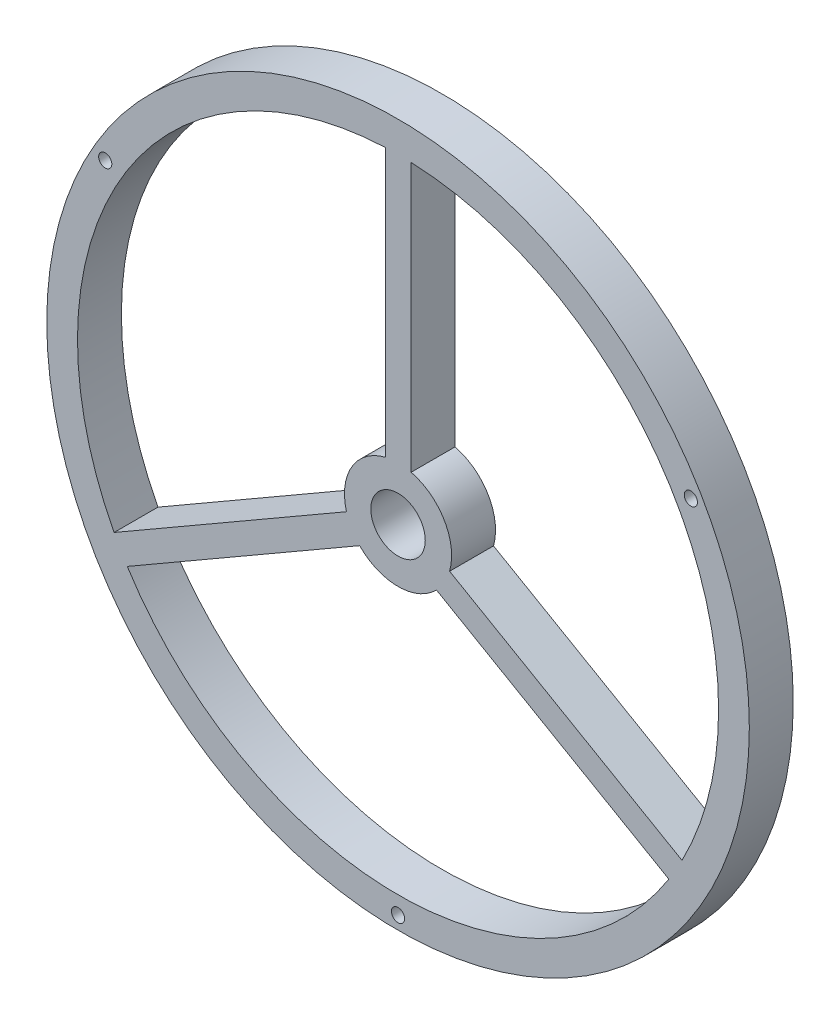
ISO-10303-21;
HEADER;
FILE_DESCRIPTION(('STEP AP214'),'2;1');
FILE_NAME('part.step','',(''),(''),'','','');
FILE_SCHEMA(('AUTOMOTIVE_DESIGN { 1 0 10303 214 1 1 1 1 }'));
ENDSEC;
DATA;
#1=APPLICATION_CONTEXT('core data for automotive mechanical design processes');
#2=APPLICATION_PROTOCOL_DEFINITION('international standard','automotive_design',2000,#1);
#3=PRODUCT_CONTEXT('',#1,'mechanical');
#4=PRODUCT('Part','Part','',(#3));
#5=PRODUCT_RELATED_PRODUCT_CATEGORY('part','',(#4));
#6=PRODUCT_DEFINITION_FORMATION('','',#4);
#7=PRODUCT_DEFINITION_CONTEXT('part definition',#1,'design');
#8=PRODUCT_DEFINITION('design','',#6,#7);
#9=PRODUCT_DEFINITION_SHAPE('','',#8);
#10=(LENGTH_UNIT() NAMED_UNIT(*) SI_UNIT(.MILLI.,.METRE.));
#11=(NAMED_UNIT(*) PLANE_ANGLE_UNIT() SI_UNIT($,.RADIAN.));
#12=(NAMED_UNIT(*) SI_UNIT($,.STERADIAN.) SOLID_ANGLE_UNIT());
#13=UNCERTAINTY_MEASURE_WITH_UNIT(LENGTH_MEASURE(1.E-05),#10,'distance_accuracy_value','');
#14=(GEOMETRIC_REPRESENTATION_CONTEXT(3) GLOBAL_UNCERTAINTY_ASSIGNED_CONTEXT((#13)) GLOBAL_UNIT_ASSIGNED_CONTEXT((#10,
#11,#12)) REPRESENTATION_CONTEXT('',''));
#15=CARTESIAN_POINT('',(0.,0.,0.));
#16=DIRECTION('',(0.,0.,1.));
#17=DIRECTION('',(1.,0.,0.));
#18=AXIS2_PLACEMENT_3D('',#15,#16,#17);
#19=CARTESIAN_POINT('',(46.8483422096142,0.,5.));
#20=DIRECTION('',(1.,0.,0.));
#21=DIRECTION('',(0.,1.,0.));
#22=AXIS2_PLACEMENT_3D('',#19,#20,#21);
#23=PLANE('',#22);
#24=DIRECTION('',(0.,-1.,0.));
#25=VECTOR('',#24,1.);
#26=CARTESIAN_POINT('',(46.8483422096142,0.,0.));
#27=LINE('',#26,#25);
#28=CARTESIAN_POINT('',(46.8483422096142,64.3961689263442,0.));
#29=VERTEX_POINT('',#28);
#30=CARTESIAN_POINT('',(46.8483422096142,33.8505224689132,0.));
#31=VERTEX_POINT('',#30);
#32=EDGE_CURVE('E188',#29,#31,#27,.T.);
#33=ORIENTED_EDGE('',*,*,#32,.T.);
#34=DIRECTION('',(0.,0.,-1.));
#35=VECTOR('',#34,1.);
#36=CARTESIAN_POINT('',(46.8483422096142,33.8505224689132,5.));
#37=LINE('',#36,#35);
#38=CARTESIAN_POINT('',(46.8483422096142,33.8505224689132,5.));
#39=VERTEX_POINT('',#38);
#40=EDGE_CURVE('E11',#39,#31,#37,.T.);
#41=ORIENTED_EDGE('',*,*,#40,.F.);
#42=DIRECTION('',(0.,-1.,0.));
#43=VECTOR('',#42,1.);
#44=CARTESIAN_POINT('',(46.8483422096142,0.,5.));
#45=LINE('',#44,#43);
#46=CARTESIAN_POINT('',(46.8483422096142,64.3961689263442,5.));
#47=VERTEX_POINT('',#46);
#48=EDGE_CURVE('E140',#47,#39,#45,.T.);
#49=ORIENTED_EDGE('',*,*,#48,.F.);
#50=DIRECTION('',(0.,0.,-1.));
#51=VECTOR('',#50,1.);
#52=CARTESIAN_POINT('',(46.8483422096142,64.3961689263442,5.));
#53=LINE('',#52,#51);
#54=EDGE_CURVE('E54',#47,#29,#53,.T.);
#55=ORIENTED_EDGE('',*,*,#54,.T.);
#56=EDGE_LOOP('',(#33,#41,#49,#55));
#57=FACE_BOUND('',#56,.T.);
#58=ADVANCED_FACE('F35',(#57),#23,.F.);
#59=CARTESIAN_POINT('',(48.2964743549606,27.9249074552953,5.));
#60=DIRECTION('',(0.,0.,-1.));
#61=DIRECTION('',(-1.,0.,0.));
#62=AXIS2_PLACEMENT_3D('',#59,#60,#61);
#63=CYLINDRICAL_SURFACE('',#62,6.1);
#64=CARTESIAN_POINT('',(48.2964743549606,27.9249074552953,0.));
#65=DIRECTION('',(0.,0.,1.));
#66=DIRECTION('',(1.,0.,0.));
#67=AXIS2_PLACEMENT_3D('',#64,#65,#66);
#68=CIRCLE('',#67,6.1);
#69=CARTESIAN_POINT('',(42.4259275091637,26.267596461153,0.));
#70=VERTEX_POINT('',#69);
#71=EDGE_CURVE('E147',#31,#70,#68,.T.);
#72=ORIENTED_EDGE('',*,*,#71,.T.);
#73=DIRECTION('',(0.,0.,-1.));
#74=VECTOR('',#73,1.);
#75=CARTESIAN_POINT('',(42.4259275091637,26.267596461153,5.));
#76=LINE('',#75,#74);
#77=CARTESIAN_POINT('',(42.4259275091637,26.267596461153,5.));
#78=VERTEX_POINT('',#77);
#79=EDGE_CURVE('E45',#78,#70,#76,.T.);
#80=ORIENTED_EDGE('',*,*,#79,.F.);
#81=CARTESIAN_POINT('',(48.2964743549606,27.9249074552953,5.));
#82=DIRECTION('',(0.,0.,1.));
#83=DIRECTION('',(1.,0.,0.));
#84=AXIS2_PLACEMENT_3D('',#81,#82,#83);
#85=CIRCLE('',#84,6.1);
#86=EDGE_CURVE('E133',#39,#78,#85,.T.);
#87=ORIENTED_EDGE('',*,*,#86,.F.);
#88=ORIENTED_EDGE('',*,*,#40,.T.);
#89=EDGE_LOOP('',(#72,#80,#87,#88));
#90=FACE_BOUND('',#89,.T.);
#91=ADVANCED_FACE('F146',(#90),#63,.T.);
#92=CARTESIAN_POINT('',(-0.767721038567435,1.32973184483834,5.));
#93=DIRECTION('',(-0.5,0.866025403784438,0.));
#94=DIRECTION('',(-0.866025403784438,-0.5,0.));
#95=AXIS2_PLACEMENT_3D('',#92,#93,#94);
#96=PLANE('',#95);
#97=DIRECTION('',(0.866025403784439,0.5,0.));
#98=VECTOR('',#97,1.);
#99=CARTESIAN_POINT('',(-0.767721038567435,1.32973184483834,0.));
#100=LINE('',#99,#98);
#101=CARTESIAN_POINT('',(15.963250960253,10.9893630321614,0.));
#102=VERTEX_POINT('',#101);
#103=EDGE_CURVE('E190',#102,#70,#100,.T.);
#104=ORIENTED_EDGE('',*,*,#103,.F.);
#105=DIRECTION('',(0.,0.,-1.));
#106=VECTOR('',#105,1.);
#107=CARTESIAN_POINT('',(15.963250960253,10.9893630321614,5.));
#108=LINE('',#107,#106);
#109=CARTESIAN_POINT('',(15.963250960253,10.9893630321614,5.));
#110=VERTEX_POINT('',#109);
#111=EDGE_CURVE('E92',#110,#102,#108,.T.);
#112=ORIENTED_EDGE('',*,*,#111,.F.);
#113=DIRECTION('',(0.866025403784439,0.5,0.));
#114=VECTOR('',#113,1.);
#115=CARTESIAN_POINT('',(-0.767721038567435,1.32973184483834,5.));
#116=LINE('',#115,#114);
#117=EDGE_CURVE('E139',#110,#78,#116,.T.);
#118=ORIENTED_EDGE('',*,*,#117,.T.);
#119=ORIENTED_EDGE('',*,*,#79,.T.);
#120=EDGE_LOOP('',(#104,#112,#118,#119));
#121=FACE_BOUND('',#120,.T.);
#122=ADVANCED_FACE('F151',(#121),#96,.T.);
#123=CARTESIAN_POINT('',(43.9259275091637,23.6695202497997,0.));
#124=VERTEX_POINT('',#123);
#125=CARTESIAN_POINT('',(52.6670212007574,23.6695202497997,0.));
#126=VERTEX_POINT('',#125);
#127=EDGE_CURVE('E172',#124,#126,#68,.T.);
#128=ORIENTED_EDGE('',*,*,#127,.T.);
#129=DIRECTION('',(0.,0.,-1.));
#130=VECTOR('',#129,1.);
#131=CARTESIAN_POINT('',(52.6670212007574,23.6695202497997,5.));
#132=LINE('',#131,#130);
#133=CARTESIAN_POINT('',(52.6670212007574,23.6695202497997,5.));
#134=VERTEX_POINT('',#133);
#135=EDGE_CURVE('E199',#134,#126,#132,.T.);
#136=ORIENTED_EDGE('',*,*,#135,.F.);
#137=CARTESIAN_POINT('',(43.9259275091637,23.6695202497997,5.));
#138=VERTEX_POINT('',#137);
#139=EDGE_CURVE('E144',#138,#134,#85,.T.);
#140=ORIENTED_EDGE('',*,*,#139,.F.);
#141=DIRECTION('',(0.,0.,-1.));
#142=VECTOR('',#141,1.);
#143=CARTESIAN_POINT('',(43.9259275091637,23.6695202497997,5.));
#144=LINE('',#143,#142);
#145=EDGE_CURVE('E201',#138,#124,#144,.T.);
#146=ORIENTED_EDGE('',*,*,#145,.T.);
#147=EDGE_LOOP('',(#128,#136,#140,#146));
#148=FACE_BOUND('',#147,.T.);
#149=ADVANCED_FACE('F303',(#148),#63,.T.);
#150=CARTESIAN_POINT('',(23.4159582160477,40.5576293381045,5.));
#151=DIRECTION('',(0.5,0.866025403784439,0.));
#152=DIRECTION('',(-0.866025403784439,0.5,0.));
#153=AXIS2_PLACEMENT_3D('',#150,#151,#152);
#154=PLANE('',#153);
#155=DIRECTION('',(0.866025403784439,-0.5,0.));
#156=VECTOR('',#155,1.);
#157=CARTESIAN_POINT('',(23.4159582160477,40.5576293381045,0.));
#158=LINE('',#157,#156);
#159=CARTESIAN_POINT('',(79.1296977496681,8.39128682080813,0.));
#160=VERTEX_POINT('',#159);
#161=EDGE_CURVE('E182',#126,#160,#158,.T.);
#162=ORIENTED_EDGE('',*,*,#161,.T.);
#163=DIRECTION('',(0.,0.,-1.));
#164=VECTOR('',#163,1.);
#165=CARTESIAN_POINT('',(79.1296977496681,8.39128682080813,5.));
#166=LINE('',#165,#164);
#167=CARTESIAN_POINT('',(79.1296977496681,8.39128682080813,5.));
#168=VERTEX_POINT('',#167);
#169=EDGE_CURVE('E205',#168,#160,#166,.T.);
#170=ORIENTED_EDGE('',*,*,#169,.F.);
#171=DIRECTION('',(0.866025403784439,-0.5,0.));
#172=VECTOR('',#171,1.);
#173=CARTESIAN_POINT('',(23.4159582160477,40.5576293381045,5.));
#174=LINE('',#173,#172);
#175=EDGE_CURVE('E239',#134,#168,#174,.T.);
#176=ORIENTED_EDGE('',*,*,#175,.F.);
#177=ORIENTED_EDGE('',*,*,#135,.T.);
#178=EDGE_LOOP('',(#162,#170,#176,#177));
#179=FACE_BOUND('',#178,.T.);
#180=ADVANCED_FACE('F311',(#179),#154,.F.);
#181=CARTESIAN_POINT('',(48.2964743549606,27.9249074552953,5.));
#182=DIRECTION('',(0.,0.,-1.));
#183=DIRECTION('',(-1.,0.,0.));
#184=AXIS2_PLACEMENT_3D('',#181,#182,#183);
#185=CYLINDRICAL_SURFACE('',#184,36.5);
#186=CARTESIAN_POINT('',(48.2964743549606,27.9249074552953,0.));
#187=DIRECTION('',(0.,0.,1.));
#188=DIRECTION('',(1.,0.,0.));
#189=AXIS2_PLACEMENT_3D('',#186,#187,#188);
#190=CIRCLE('',#189,36.5);
#191=CARTESIAN_POINT('',(17.463250960253,8.39128682080814,0.));
#192=VERTEX_POINT('',#191);
#193=EDGE_CURVE('E180',#192,#160,#190,.T.);
#194=ORIENTED_EDGE('',*,*,#193,.F.);
#195=DIRECTION('',(0.,0.,-1.));
#196=VECTOR('',#195,1.);
#197=CARTESIAN_POINT('',(17.463250960253,8.39128682080814,5.));
#198=LINE('',#197,#196);
#199=CARTESIAN_POINT('',(17.463250960253,8.39128682080814,5.));
#200=VERTEX_POINT('',#199);
#201=EDGE_CURVE('E203',#200,#192,#198,.T.);
#202=ORIENTED_EDGE('',*,*,#201,.F.);
#203=CARTESIAN_POINT('',(48.2964743549606,27.9249074552953,5.));
#204=DIRECTION('',(0.,0.,1.));
#205=DIRECTION('',(1.,0.,0.));
#206=AXIS2_PLACEMENT_3D('',#203,#204,#205);
#207=CIRCLE('',#206,36.5);
#208=EDGE_CURVE('E156',#200,#168,#207,.T.);
#209=ORIENTED_EDGE('',*,*,#208,.T.);
#210=ORIENTED_EDGE('',*,*,#169,.T.);
#211=EDGE_LOOP('',(#194,#202,#209,#210));
#212=FACE_BOUND('',#211,.T.);
#213=ADVANCED_FACE('F313',(#212),#185,.F.);
#214=CARTESIAN_POINT('',(54.1670212007574,26.267596461153,0.));
#215=VERTEX_POINT('',#214);
#216=CARTESIAN_POINT('',(49.7879309777147,33.8397664681918,0.));
#217=VERTEX_POINT('',#216);
#218=EDGE_CURVE('E167',#215,#217,#68,.T.);
#219=ORIENTED_EDGE('',*,*,#218,.T.);
#220=DIRECTION('',(0.,0.,-1.));
#221=VECTOR('',#220,1.);
#222=CARTESIAN_POINT('',(49.7879309777147,33.8397664681918,5.));
#223=LINE('',#222,#221);
#224=CARTESIAN_POINT('',(49.7879309777147,33.8397664681918,5.));
#225=VERTEX_POINT('',#224);
#226=EDGE_CURVE('E39',#225,#217,#223,.T.);
#227=ORIENTED_EDGE('',*,*,#226,.F.);
#228=CARTESIAN_POINT('',(54.1670212007574,26.267596461153,5.));
#229=VERTEX_POINT('',#228);
#230=EDGE_CURVE('E105',#229,#225,#85,.T.);
#231=ORIENTED_EDGE('',*,*,#230,.F.);
#232=DIRECTION('',(0.,0.,-1.));
#233=VECTOR('',#232,1.);
#234=CARTESIAN_POINT('',(54.1670212007574,26.267596461153,5.));
#235=LINE('',#234,#233);
#236=EDGE_CURVE('E166',#229,#215,#235,.T.);
#237=ORIENTED_EDGE('',*,*,#236,.T.);
#238=EDGE_LOOP('',(#219,#227,#231,#237));
#239=FACE_BOUND('',#238,.T.);
#240=ADVANCED_FACE('F222',(#239),#63,.T.);
#241=CARTESIAN_POINT('',(49.7879309777147,0.,5.));
#242=DIRECTION('',(1.,0.,0.));
#243=DIRECTION('',(0.,1.,0.));
#244=AXIS2_PLACEMENT_3D('',#241,#242,#243);
#245=PLANE('',#244);
#246=DIRECTION('',(0.,-1.,0.));
#247=VECTOR('',#246,1.);
#248=CARTESIAN_POINT('',(49.7879309777147,0.,0.));
#249=LINE('',#248,#247);
#250=CARTESIAN_POINT('',(49.7879309777147,64.3944229050849,0.));
#251=VERTEX_POINT('',#250);
#252=EDGE_CURVE('E170',#251,#217,#249,.T.);
#253=ORIENTED_EDGE('',*,*,#252,.F.);
#254=DIRECTION('',(0.,0.,-1.));
#255=VECTOR('',#254,1.);
#256=CARTESIAN_POINT('',(49.7879309777147,64.3944229050849,5.));
#257=LINE('',#256,#255);
#258=CARTESIAN_POINT('',(49.7879309777147,64.3944229050849,5.));
#259=VERTEX_POINT('',#258);
#260=EDGE_CURVE('E212',#259,#251,#257,.T.);
#261=ORIENTED_EDGE('',*,*,#260,.F.);
#262=DIRECTION('',(0.,-1.,0.));
#263=VECTOR('',#262,1.);
#264=CARTESIAN_POINT('',(49.7879309777147,0.,5.));
#265=LINE('',#264,#263);
#266=EDGE_CURVE('E219',#259,#225,#265,.T.);
#267=ORIENTED_EDGE('',*,*,#266,.T.);
#268=ORIENTED_EDGE('',*,*,#226,.T.);
#269=EDGE_LOOP('',(#253,#261,#267,#268));
#270=FACE_BOUND('',#269,.T.);
#271=ADVANCED_FACE('F37',(#270),#245,.T.);
#272=CARTESIAN_POINT('',(80.6296977496681,10.9893630321614,0.));
#273=VERTEX_POINT('',#272);
#274=EDGE_CURVE('E175',#273,#251,#190,.T.);
#275=ORIENTED_EDGE('',*,*,#274,.F.);
#276=DIRECTION('',(0.,0.,-1.));
#277=VECTOR('',#276,1.);
#278=CARTESIAN_POINT('',(80.6296977496681,10.9893630321614,5.));
#279=LINE('',#278,#277);
#280=CARTESIAN_POINT('',(80.6296977496681,10.9893630321614,5.));
#281=VERTEX_POINT('',#280);
#282=EDGE_CURVE('E211',#281,#273,#279,.T.);
#283=ORIENTED_EDGE('',*,*,#282,.F.);
#284=EDGE_CURVE('E157',#281,#259,#207,.T.);
#285=ORIENTED_EDGE('',*,*,#284,.T.);
#286=ORIENTED_EDGE('',*,*,#260,.T.);
#287=EDGE_LOOP('',(#275,#283,#285,#286));
#288=FACE_BOUND('',#287,.T.);
#289=ADVANCED_FACE('F228',(#288),#185,.F.);
#290=CARTESIAN_POINT('',(48.2964743549606,27.9249074552953,5.));
#291=DIRECTION('',(0.,0.,-1.));
#292=DIRECTION('',(-1.,0.,0.));
#293=AXIS2_PLACEMENT_3D('',#290,#291,#292);
#294=CYLINDRICAL_SURFACE('',#293,40.);
#295=CARTESIAN_POINT('',(48.2964743549606,27.9249074552953,5.));
#296=DIRECTION('',(0.,0.,1.));
#297=DIRECTION('',(1.,0.,0.));
#298=AXIS2_PLACEMENT_3D('',#295,#296,#297);
#299=CIRCLE('',#298,40.);
#300=CARTESIAN_POINT('',(88.2964743549606,27.9249074552953,5.));
#301=VERTEX_POINT('',#300);
#302=EDGE_CURVE('E154',#301,#301,#299,.T.);
#303=ORIENTED_EDGE('',*,*,#302,.F.);
#304=EDGE_LOOP('',(#303));
#305=FACE_BOUND('',#304,.T.);
#306=CARTESIAN_POINT('',(48.2964743549606,27.9249074552953,0.));
#307=DIRECTION('',(0.,0.,1.));
#308=DIRECTION('',(1.,0.,0.));
#309=AXIS2_PLACEMENT_3D('',#306,#307,#308);
#310=CIRCLE('',#309,40.);
#311=CARTESIAN_POINT('',(88.2964743549606,27.9249074552953,0.));
#312=VERTEX_POINT('',#311);
#313=EDGE_CURVE('E192',#312,#312,#310,.T.);
#314=ORIENTED_EDGE('',*,*,#313,.T.);
#315=EDGE_LOOP('',(#314));
#316=FACE_BOUND('',#315,.T.);
#317=ADVANCED_FACE('F325',(#305,#316),#294,.T.);
#318=EDGE_CURVE('E179',#29,#102,#190,.T.);
#319=ORIENTED_EDGE('',*,*,#318,.F.);
#320=ORIENTED_EDGE('',*,*,#54,.F.);
#321=EDGE_CURVE('E152',#47,#110,#207,.T.);
#322=ORIENTED_EDGE('',*,*,#321,.T.);
#323=ORIENTED_EDGE('',*,*,#111,.T.);
#324=EDGE_LOOP('',(#319,#320,#322,#323));
#325=FACE_BOUND('',#324,.T.);
#326=ADVANCED_FACE('F309',(#325),#185,.F.);
#327=CARTESIAN_POINT('',(0.732278961432563,-1.26834436651497,5.));
#328=DIRECTION('',(0.5,-0.866025403784439,0.));
#329=DIRECTION('',(0.866025403784439,0.5,0.));
#330=AXIS2_PLACEMENT_3D('',#327,#328,#329);
#331=PLANE('',#330);
#332=DIRECTION('',(-0.866025403784439,-0.5,0.));
#333=VECTOR('',#332,1.);
#334=CARTESIAN_POINT('',(0.732278961432563,-1.26834436651497,0.));
#335=LINE('',#334,#333);
#336=EDGE_CURVE('E185',#124,#192,#335,.T.);
#337=ORIENTED_EDGE('',*,*,#336,.F.);
#338=ORIENTED_EDGE('',*,*,#145,.F.);
#339=DIRECTION('',(-0.866025403784439,-0.5,0.));
#340=VECTOR('',#339,1.);
#341=CARTESIAN_POINT('',(0.732278961432563,-1.26834436651497,5.));
#342=LINE('',#341,#340);
#343=EDGE_CURVE('E238',#138,#200,#342,.T.);
#344=ORIENTED_EDGE('',*,*,#343,.T.);
#345=ORIENTED_EDGE('',*,*,#201,.T.);
#346=EDGE_LOOP('',(#337,#338,#344,#345));
#347=FACE_BOUND('',#346,.T.);
#348=ADVANCED_FACE('F306',(#347),#331,.T.);
#349=CARTESIAN_POINT('',(24.9159582160477,43.1557055494579,5.));
#350=DIRECTION('',(-0.5,-0.866025403784439,0.));
#351=DIRECTION('',(0.866025403784439,-0.5,0.));
#352=AXIS2_PLACEMENT_3D('',#349,#350,#351);
#353=PLANE('',#352);
#354=DIRECTION('',(-0.866025403784439,0.5,0.));
#355=VECTOR('',#354,1.);
#356=CARTESIAN_POINT('',(24.9159582160477,43.1557055494579,0.));
#357=LINE('',#356,#355);
#358=EDGE_CURVE('E178',#273,#215,#357,.T.);
#359=ORIENTED_EDGE('',*,*,#358,.T.);
#360=ORIENTED_EDGE('',*,*,#236,.F.);
#361=DIRECTION('',(-0.866025403784439,0.5,0.));
#362=VECTOR('',#361,1.);
#363=CARTESIAN_POINT('',(24.9159582160477,43.1557055494579,5.));
#364=LINE('',#363,#362);
#365=EDGE_CURVE('E232',#281,#229,#364,.T.);
#366=ORIENTED_EDGE('',*,*,#365,.F.);
#367=ORIENTED_EDGE('',*,*,#282,.T.);
#368=EDGE_LOOP('',(#359,#360,#366,#367));
#369=FACE_BOUND('',#368,.T.);
#370=ADVANCED_FACE('F233',(#369),#353,.F.);
#371=CARTESIAN_POINT('',(48.2964743549606,27.9249074552953,5.));
#372=DIRECTION('',(0.,0.,-1.));
#373=DIRECTION('',(-1.,0.,0.));
#374=AXIS2_PLACEMENT_3D('',#371,#372,#373);
#375=CYLINDRICAL_SURFACE('',#374,3.1);
#376=CARTESIAN_POINT('',(48.2964743549606,27.9249074552953,5.));
#377=DIRECTION('',(0.,0.,1.));
#378=DIRECTION('',(1.,0.,0.));
#379=AXIS2_PLACEMENT_3D('',#376,#377,#378);
#380=CIRCLE('',#379,3.1);
#381=CARTESIAN_POINT('',(51.3964743549606,27.9249074552953,5.));
#382=VERTEX_POINT('',#381);
#383=EDGE_CURVE('E163',#382,#382,#380,.T.);
#384=ORIENTED_EDGE('',*,*,#383,.T.);
#385=EDGE_LOOP('',(#384));
#386=FACE_BOUND('',#385,.T.);
#387=CARTESIAN_POINT('',(48.2964743549606,27.9249074552953,0.));
#388=DIRECTION('',(0.,0.,1.));
#389=DIRECTION('',(1.,0.,0.));
#390=AXIS2_PLACEMENT_3D('',#387,#388,#389);
#391=CIRCLE('',#390,3.1);
#392=CARTESIAN_POINT('',(51.3964743549606,27.9249074552953,0.));
#393=VERTEX_POINT('',#392);
#394=EDGE_CURVE('E195',#393,#393,#391,.T.);
#395=ORIENTED_EDGE('',*,*,#394,.F.);
#396=EDGE_LOOP('',(#395));
#397=FACE_BOUND('',#396,.T.);
#398=ADVANCED_FACE('F279',(#386,#397),#375,.F.);
#399=CARTESIAN_POINT('',(0.,0.,5.));
#400=DIRECTION('',(0.,0.,1.));
#401=DIRECTION('',(1.,0.,0.));
#402=AXIS2_PLACEMENT_3D('',#399,#400,#401);
#403=PLANE('',#402);
#404=CARTESIAN_POINT('',(14.9544963092596,47.1749074552951,5.));
#405=DIRECTION('',(0.,0.,1.));
#406=DIRECTION('',(1.,0.,0.));
#407=AXIS2_PLACEMENT_3D('',#404,#405,#406);
#408=CIRCLE('',#407,0.750000000000002);
#409=CARTESIAN_POINT('',(15.7044963092596,47.1749074552951,5.));
#410=VERTEX_POINT('',#409);
#411=EDGE_CURVE('E262',#410,#410,#408,.T.);
#412=ORIENTED_EDGE('',*,*,#411,.F.);
#413=EDGE_LOOP('',(#412));
#414=FACE_BOUND('',#413,.T.);
#415=CARTESIAN_POINT('',(48.2964743549606,-10.5750925447047,5.));
#416=DIRECTION('',(0.,0.,1.));
#417=DIRECTION('',(1.,0.,0.));
#418=AXIS2_PLACEMENT_3D('',#415,#416,#417);
#419=CIRCLE('',#418,0.749999999999999);
#420=CARTESIAN_POINT('',(49.0464743549606,-10.5750925447047,5.));
#421=VERTEX_POINT('',#420);
#422=EDGE_CURVE('E256',#421,#421,#419,.T.);
#423=ORIENTED_EDGE('',*,*,#422,.F.);
#424=EDGE_LOOP('',(#423));
#425=FACE_BOUND('',#424,.T.);
#426=CARTESIAN_POINT('',(81.6384524006614,47.1749074552953,5.));
#427=DIRECTION('',(0.,0.,1.));
#428=DIRECTION('',(1.,0.,0.));
#429=AXIS2_PLACEMENT_3D('',#426,#427,#428);
#430=CIRCLE('',#429,0.749999999999999);
#431=CARTESIAN_POINT('',(82.3884524006614,47.1749074552953,5.));
#432=VERTEX_POINT('',#431);
#433=EDGE_CURVE('E250',#432,#432,#430,.T.);
#434=ORIENTED_EDGE('',*,*,#433,.F.);
#435=EDGE_LOOP('',(#434));
#436=FACE_BOUND('',#435,.T.);
#437=ORIENTED_EDGE('',*,*,#230,.T.);
#438=ORIENTED_EDGE('',*,*,#266,.F.);
#439=ORIENTED_EDGE('',*,*,#284,.F.);
#440=ORIENTED_EDGE('',*,*,#365,.T.);
#441=EDGE_LOOP('',(#437,#438,#439,#440));
#442=FACE_BOUND('',#441,.T.);
#443=ORIENTED_EDGE('',*,*,#139,.T.);
#444=ORIENTED_EDGE('',*,*,#175,.T.);
#445=ORIENTED_EDGE('',*,*,#208,.F.);
#446=ORIENTED_EDGE('',*,*,#343,.F.);
#447=EDGE_LOOP('',(#443,#444,#445,#446));
#448=FACE_BOUND('',#447,.T.);
#449=ORIENTED_EDGE('',*,*,#48,.T.);
#450=ORIENTED_EDGE('',*,*,#86,.T.);
#451=ORIENTED_EDGE('',*,*,#117,.F.);
#452=ORIENTED_EDGE('',*,*,#321,.F.);
#453=EDGE_LOOP('',(#449,#450,#451,#452));
#454=FACE_BOUND('',#453,.T.);
#455=ORIENTED_EDGE('',*,*,#302,.T.);
#456=EDGE_LOOP('',(#455));
#457=FACE_BOUND('',#456,.T.);
#458=ORIENTED_EDGE('',*,*,#383,.F.);
#459=EDGE_LOOP('',(#458));
#460=FACE_BOUND('',#459,.T.);
#461=ADVANCED_FACE('F135',(#414,#425,#436,#442,#448,#454,#457,#460),#403,.T.);
#462=CARTESIAN_POINT('',(0.,0.,0.));
#463=DIRECTION('',(0.,0.,1.));
#464=DIRECTION('',(1.,0.,0.));
#465=AXIS2_PLACEMENT_3D('',#462,#463,#464);
#466=PLANE('',#465);
#467=CARTESIAN_POINT('',(14.9544963092596,47.1749074552951,0.));
#468=DIRECTION('',(0.,0.,1.));
#469=DIRECTION('',(1.,0.,0.));
#470=AXIS2_PLACEMENT_3D('',#467,#468,#469);
#471=CIRCLE('',#470,0.750000000000002);
#472=CARTESIAN_POINT('',(15.7044963092596,47.1749074552951,0.));
#473=VERTEX_POINT('',#472);
#474=EDGE_CURVE('E171',#473,#473,#471,.T.);
#475=ORIENTED_EDGE('',*,*,#474,.T.);
#476=EDGE_LOOP('',(#475));
#477=FACE_BOUND('',#476,.T.);
#478=CARTESIAN_POINT('',(48.2964743549606,-10.5750925447047,0.));
#479=DIRECTION('',(0.,0.,1.));
#480=DIRECTION('',(1.,0.,0.));
#481=AXIS2_PLACEMENT_3D('',#478,#479,#480);
#482=CIRCLE('',#481,0.749999999999999);
#483=CARTESIAN_POINT('',(49.0464743549606,-10.5750925447047,0.));
#484=VERTEX_POINT('',#483);
#485=EDGE_CURVE('E259',#484,#484,#482,.T.);
#486=ORIENTED_EDGE('',*,*,#485,.T.);
#487=EDGE_LOOP('',(#486));
#488=FACE_BOUND('',#487,.T.);
#489=CARTESIAN_POINT('',(81.6384524006614,47.1749074552953,0.));
#490=DIRECTION('',(0.,0.,1.));
#491=DIRECTION('',(1.,0.,0.));
#492=AXIS2_PLACEMENT_3D('',#489,#490,#491);
#493=CIRCLE('',#492,0.749999999999999);
#494=CARTESIAN_POINT('',(82.3884524006614,47.1749074552953,0.));
#495=VERTEX_POINT('',#494);
#496=EDGE_CURVE('E253',#495,#495,#493,.T.);
#497=ORIENTED_EDGE('',*,*,#496,.T.);
#498=EDGE_LOOP('',(#497));
#499=FACE_BOUND('',#498,.T.);
#500=ORIENTED_EDGE('',*,*,#218,.F.);
#501=ORIENTED_EDGE('',*,*,#358,.F.);
#502=ORIENTED_EDGE('',*,*,#274,.T.);
#503=ORIENTED_EDGE('',*,*,#252,.T.);
#504=EDGE_LOOP('',(#500,#501,#502,#503));
#505=FACE_BOUND('',#504,.T.);
#506=ORIENTED_EDGE('',*,*,#127,.F.);
#507=ORIENTED_EDGE('',*,*,#336,.T.);
#508=ORIENTED_EDGE('',*,*,#193,.T.);
#509=ORIENTED_EDGE('',*,*,#161,.F.);
#510=EDGE_LOOP('',(#506,#507,#508,#509));
#511=FACE_BOUND('',#510,.T.);
#512=ORIENTED_EDGE('',*,*,#32,.F.);
#513=ORIENTED_EDGE('',*,*,#318,.T.);
#514=ORIENTED_EDGE('',*,*,#103,.T.);
#515=ORIENTED_EDGE('',*,*,#71,.F.);
#516=EDGE_LOOP('',(#512,#513,#514,#515));
#517=FACE_BOUND('',#516,.T.);
#518=ORIENTED_EDGE('',*,*,#313,.F.);
#519=EDGE_LOOP('',(#518));
#520=FACE_BOUND('',#519,.T.);
#521=ORIENTED_EDGE('',*,*,#394,.T.);
#522=EDGE_LOOP('',(#521));
#523=FACE_BOUND('',#522,.T.);
#524=ADVANCED_FACE('F226',(#477,#488,#499,#505,#511,#517,#520,#523),#466,.F.);
#525=CARTESIAN_POINT('',(81.6384524006614,47.1749074552953,0.));
#526=DIRECTION('',(0.,0.,1.));
#527=DIRECTION('',(1.,0.,0.));
#528=AXIS2_PLACEMENT_3D('',#525,#526,#527);
#529=CYLINDRICAL_SURFACE('',#528,0.749999999999999);
#530=ORIENTED_EDGE('',*,*,#496,.F.);
#531=EDGE_LOOP('',(#530));
#532=FACE_BOUND('',#531,.T.);
#533=ORIENTED_EDGE('',*,*,#433,.T.);
#534=EDGE_LOOP('',(#533));
#535=FACE_BOUND('',#534,.T.);
#536=ADVANCED_FACE('F285',(#532,#535),#529,.F.);
#537=CARTESIAN_POINT('',(48.2964743549606,-10.5750925447047,0.));
#538=DIRECTION('',(0.,0.,1.));
#539=DIRECTION('',(1.,0.,0.));
#540=AXIS2_PLACEMENT_3D('',#537,#538,#539);
#541=CYLINDRICAL_SURFACE('',#540,0.749999999999999);
#542=ORIENTED_EDGE('',*,*,#485,.F.);
#543=EDGE_LOOP('',(#542));
#544=FACE_BOUND('',#543,.T.);
#545=ORIENTED_EDGE('',*,*,#422,.T.);
#546=EDGE_LOOP('',(#545));
#547=FACE_BOUND('',#546,.T.);
#548=ADVANCED_FACE('F273',(#544,#547),#541,.F.);
#549=CARTESIAN_POINT('',(14.9544963092596,47.1749074552951,0.));
#550=DIRECTION('',(0.,0.,1.));
#551=DIRECTION('',(1.,0.,0.));
#552=AXIS2_PLACEMENT_3D('',#549,#550,#551);
#553=CYLINDRICAL_SURFACE('',#552,0.750000000000002);
#554=ORIENTED_EDGE('',*,*,#474,.F.);
#555=EDGE_LOOP('',(#554));
#556=FACE_BOUND('',#555,.T.);
#557=ORIENTED_EDGE('',*,*,#411,.T.);
#558=EDGE_LOOP('',(#557));
#559=FACE_BOUND('',#558,.T.);
#560=ADVANCED_FACE('F270',(#556,#559),#553,.F.);
#561=CLOSED_SHELL('',(#58,#91,#122,#149,#180,#213,#240,#271,#289,#317,#326,#348,#370,#398,#461,
#524,#536,#548,#560));
#562=MANIFOLD_SOLID_BREP('B2',#561);
#563=ADVANCED_BREP_SHAPE_REPRESENTATION('',(#18,#562),#14);
#564=SHAPE_DEFINITION_REPRESENTATION(#9,#563);
ENDSEC;
END-ISO-10303-21;
